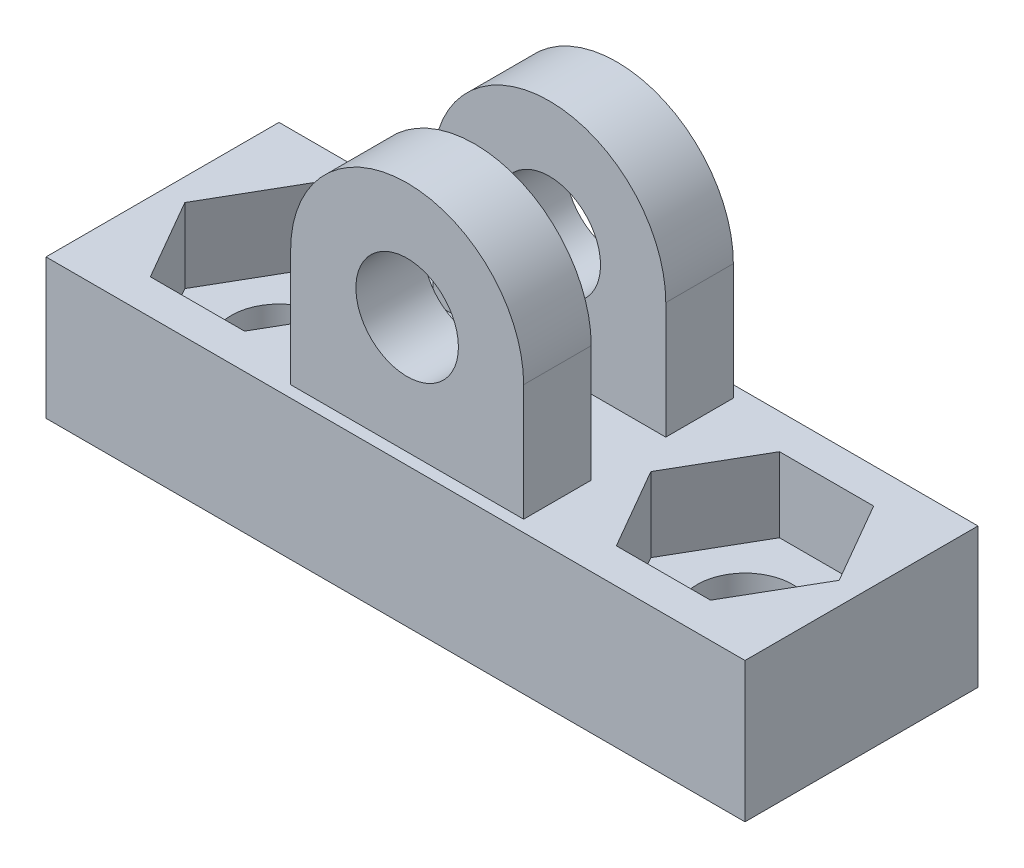
ISO-10303-21;
HEADER;
FILE_DESCRIPTION(('STEP AP214'),'2;1');
FILE_NAME('part.step','',(''),(''),'','','');
FILE_SCHEMA(('AUTOMOTIVE_DESIGN { 1 0 10303 214 1 1 1 1 }'));
ENDSEC;
DATA;
#1=APPLICATION_CONTEXT('core data for automotive mechanical design processes');
#2=APPLICATION_PROTOCOL_DEFINITION('international standard','automotive_design',2000,#1);
#3=PRODUCT_CONTEXT('',#1,'mechanical');
#4=PRODUCT('Part','Part','',(#3));
#5=PRODUCT_RELATED_PRODUCT_CATEGORY('part','',(#4));
#6=PRODUCT_DEFINITION_FORMATION('','',#4);
#7=PRODUCT_DEFINITION_CONTEXT('part definition',#1,'design');
#8=PRODUCT_DEFINITION('design','',#6,#7);
#9=PRODUCT_DEFINITION_SHAPE('','',#8);
#10=(LENGTH_UNIT() NAMED_UNIT(*) SI_UNIT(.MILLI.,.METRE.));
#11=(NAMED_UNIT(*) PLANE_ANGLE_UNIT() SI_UNIT($,.RADIAN.));
#12=(NAMED_UNIT(*) SI_UNIT($,.STERADIAN.) SOLID_ANGLE_UNIT());
#13=UNCERTAINTY_MEASURE_WITH_UNIT(LENGTH_MEASURE(1.E-05),#10,'distance_accuracy_value','');
#14=(GEOMETRIC_REPRESENTATION_CONTEXT(3) GLOBAL_UNCERTAINTY_ASSIGNED_CONTEXT((#13)) GLOBAL_UNIT_ASSIGNED_CONTEXT((#10,
#11,#12)) REPRESENTATION_CONTEXT('',''));
#15=CARTESIAN_POINT('',(0.,0.,0.));
#16=DIRECTION('',(0.,0.,1.));
#17=DIRECTION('',(1.,0.,0.));
#18=AXIS2_PLACEMENT_3D('',#15,#16,#17);
#19=CARTESIAN_POINT('',(15.,6.,4.5));
#20=DIRECTION('',(-1.,0.,0.));
#21=DIRECTION('',(0.,-1.,0.));
#22=AXIS2_PLACEMENT_3D('',#19,#20,#21);
#23=PLANE('',#22);
#24=DIRECTION('',(0.,1.,0.));
#25=VECTOR('',#24,1.);
#26=CARTESIAN_POINT('',(15.,6.,-1.6));
#27=LINE('',#26,#25);
#28=CARTESIAN_POINT('',(15.,6.,-1.6));
#29=VERTEX_POINT('',#28);
#30=CARTESIAN_POINT('',(15.,11.,-1.6));
#31=VERTEX_POINT('',#30);
#32=EDGE_CURVE('E441',#29,#31,#27,.T.);
#33=ORIENTED_EDGE('',*,*,#32,.F.);
#34=DIRECTION('',(0.,0.,-1.));
#35=VECTOR('',#34,1.);
#36=CARTESIAN_POINT('',(15.,6.,4.5));
#37=LINE('',#36,#35);
#38=CARTESIAN_POINT('',(15.,6.,-4.5));
#39=VERTEX_POINT('',#38);
#40=EDGE_CURVE('E229',#29,#39,#37,.T.);
#41=ORIENTED_EDGE('',*,*,#40,.T.);
#42=DIRECTION('',(0.,1.,0.));
#43=VECTOR('',#42,1.);
#44=CARTESIAN_POINT('',(15.,6.,-4.5));
#45=LINE('',#44,#43);
#46=CARTESIAN_POINT('',(15.,11.,-4.5));
#47=VERTEX_POINT('',#46);
#48=EDGE_CURVE('E470',#39,#47,#45,.T.);
#49=ORIENTED_EDGE('',*,*,#48,.T.);
#50=DIRECTION('',(0.,0.,-1.));
#51=VECTOR('',#50,1.);
#52=CARTESIAN_POINT('',(15.,11.,4.5));
#53=LINE('',#52,#51);
#54=EDGE_CURVE('E486',#31,#47,#53,.T.);
#55=ORIENTED_EDGE('',*,*,#54,.F.);
#56=EDGE_LOOP('',(#33,#41,#49,#55));
#57=FACE_BOUND('',#56,.T.);
#58=ADVANCED_FACE('F45',(#57),#23,.F.);
#59=CARTESIAN_POINT('',(10.,11.,4.5));
#60=DIRECTION('',(0.,0.,-1.));
#61=DIRECTION('',(-1.,0.,0.));
#62=AXIS2_PLACEMENT_3D('',#59,#60,#61);
#63=CYLINDRICAL_SURFACE('',#62,5.);
#64=CARTESIAN_POINT('',(10.,11.,-1.6));
#65=DIRECTION('',(0.,0.,1.));
#66=DIRECTION('',(1.,0.,0.));
#67=AXIS2_PLACEMENT_3D('',#64,#65,#66);
#68=CIRCLE('',#67,5.);
#69=CARTESIAN_POINT('',(5.,11.,-1.6));
#70=VERTEX_POINT('',#69);
#71=EDGE_CURVE('E438',#31,#70,#68,.T.);
#72=ORIENTED_EDGE('',*,*,#71,.F.);
#73=ORIENTED_EDGE('',*,*,#54,.T.);
#74=CARTESIAN_POINT('',(10.,11.,-4.5));
#75=DIRECTION('',(0.,0.,1.));
#76=DIRECTION('',(1.,0.,0.));
#77=AXIS2_PLACEMENT_3D('',#74,#75,#76);
#78=CIRCLE('',#77,5.);
#79=CARTESIAN_POINT('',(5.,11.,-4.5));
#80=VERTEX_POINT('',#79);
#81=EDGE_CURVE('E474',#47,#80,#78,.T.);
#82=ORIENTED_EDGE('',*,*,#81,.T.);
#83=DIRECTION('',(0.,0.,-1.));
#84=VECTOR('',#83,1.);
#85=CARTESIAN_POINT('',(5.,11.,4.5));
#86=LINE('',#85,#84);
#87=EDGE_CURVE('E482',#70,#80,#86,.T.);
#88=ORIENTED_EDGE('',*,*,#87,.F.);
#89=EDGE_LOOP('',(#72,#73,#82,#88));
#90=FACE_BOUND('',#89,.T.);
#91=ADVANCED_FACE('F502',(#90),#63,.T.);
#92=CARTESIAN_POINT('',(5.,6.,4.5));
#93=DIRECTION('',(1.,0.,0.));
#94=DIRECTION('',(0.,0.,-1.));
#95=AXIS2_PLACEMENT_3D('',#92,#93,#94);
#96=PLANE('',#95);
#97=DIRECTION('',(0.,-1.,0.));
#98=VECTOR('',#97,1.);
#99=CARTESIAN_POINT('',(5.,6.,-1.6));
#100=LINE('',#99,#98);
#101=CARTESIAN_POINT('',(5.,6.,-1.6));
#102=VERTEX_POINT('',#101);
#103=EDGE_CURVE('E435',#70,#102,#100,.T.);
#104=ORIENTED_EDGE('',*,*,#103,.F.);
#105=ORIENTED_EDGE('',*,*,#87,.T.);
#106=DIRECTION('',(0.,-1.,0.));
#107=VECTOR('',#106,1.);
#108=CARTESIAN_POINT('',(5.,6.,-4.5));
#109=LINE('',#108,#107);
#110=CARTESIAN_POINT('',(5.,6.,-4.5));
#111=VERTEX_POINT('',#110);
#112=EDGE_CURVE('E456',#80,#111,#109,.T.);
#113=ORIENTED_EDGE('',*,*,#112,.T.);
#114=DIRECTION('',(0.,0.,-1.));
#115=VECTOR('',#114,1.);
#116=CARTESIAN_POINT('',(5.,6.,4.5));
#117=LINE('',#116,#115);
#118=EDGE_CURVE('E466',#102,#111,#117,.T.);
#119=ORIENTED_EDGE('',*,*,#118,.F.);
#120=EDGE_LOOP('',(#104,#105,#113,#119));
#121=FACE_BOUND('',#120,.T.);
#122=ADVANCED_FACE('F495',(#121),#96,.F.);
#123=CARTESIAN_POINT('',(10.,11.,4.5));
#124=DIRECTION('',(0.,0.,-1.));
#125=DIRECTION('',(-1.,0.,0.));
#126=AXIS2_PLACEMENT_3D('',#123,#124,#125);
#127=CYLINDRICAL_SURFACE('',#126,2.20000000000086);
#128=CARTESIAN_POINT('',(10.,11.,-4.5));
#129=DIRECTION('',(0.,0.,1.));
#130=DIRECTION('',(1.,0.,0.));
#131=AXIS2_PLACEMENT_3D('',#128,#129,#130);
#132=CIRCLE('',#131,2.20000000000086);
#133=CARTESIAN_POINT('',(12.2000000000009,11.,-4.5));
#134=VERTEX_POINT('',#133);
#135=EDGE_CURVE('E444',#134,#134,#132,.T.);
#136=ORIENTED_EDGE('',*,*,#135,.F.);
#137=EDGE_LOOP('',(#136));
#138=FACE_BOUND('',#137,.T.);
#139=CARTESIAN_POINT('',(10.,11.,-1.6));
#140=DIRECTION('',(0.,0.,1.));
#141=DIRECTION('',(1.,0.,0.));
#142=AXIS2_PLACEMENT_3D('',#139,#140,#141);
#143=CIRCLE('',#142,2.20000000000086);
#144=CARTESIAN_POINT('',(12.2000000000009,11.,-1.6));
#145=VERTEX_POINT('',#144);
#146=EDGE_CURVE('E49',#145,#145,#143,.T.);
#147=ORIENTED_EDGE('',*,*,#146,.T.);
#148=EDGE_LOOP('',(#147));
#149=FACE_BOUND('',#148,.T.);
#150=ADVANCED_FACE('F516',(#138,#149),#127,.F.);
#151=CARTESIAN_POINT('',(0.,6.,0.));
#152=DIRECTION('',(0.,-1.,0.));
#153=DIRECTION('',(0.,0.,-1.));
#154=AXIS2_PLACEMENT_3D('',#151,#152,#153);
#155=PLANE('',#154);
#156=ORIENTED_EDGE('',*,*,#40,.F.);
#157=DIRECTION('',(1.,0.,0.));
#158=VECTOR('',#157,1.);
#159=CARTESIAN_POINT('',(20.0691974439735,6.,-1.6));
#160=LINE('',#159,#158);
#161=EDGE_CURVE('E222',#102,#29,#160,.T.);
#162=ORIENTED_EDGE('',*,*,#161,.F.);
#163=ORIENTED_EDGE('',*,*,#118,.T.);
#164=DIRECTION('',(1.,0.,0.));
#165=VECTOR('',#164,1.);
#166=CARTESIAN_POINT('',(15.,6.,-4.5));
#167=LINE('',#166,#165);
#168=EDGE_CURVE('E449',#111,#39,#167,.T.);
#169=ORIENTED_EDGE('',*,*,#168,.T.);
#170=EDGE_LOOP('',(#156,#162,#163,#169));
#171=FACE_BOUND('',#170,.T.);
#172=DIRECTION('',(-1.,0.,0.));
#173=VECTOR('',#172,1.);
#174=CARTESIAN_POINT('',(2.02072594216369,6.,-3.5));
#175=LINE('',#174,#173);
#176=CARTESIAN_POINT('',(2.02072594216369,6.,-3.5));
#177=VERTEX_POINT('',#176);
#178=CARTESIAN_POINT('',(-2.02072594216369,6.,-3.5));
#179=VERTEX_POINT('',#178);
#180=EDGE_CURVE('E354',#177,#179,#175,.T.);
#181=ORIENTED_EDGE('',*,*,#180,.F.);
#182=DIRECTION('',(-0.5,0.,-0.866025403784439));
#183=VECTOR('',#182,1.);
#184=CARTESIAN_POINT('',(4.04145188432738,6.,0.));
#185=LINE('',#184,#183);
#186=CARTESIAN_POINT('',(4.04145188432738,6.,0.));
#187=VERTEX_POINT('',#186);
#188=EDGE_CURVE('E351',#187,#177,#185,.T.);
#189=ORIENTED_EDGE('',*,*,#188,.F.);
#190=DIRECTION('',(0.5,0.,-0.866025403784439));
#191=VECTOR('',#190,1.);
#192=CARTESIAN_POINT('',(2.02072594216369,6.,3.5));
#193=LINE('',#192,#191);
#194=CARTESIAN_POINT('',(2.02072594216369,6.,3.5));
#195=VERTEX_POINT('',#194);
#196=EDGE_CURVE('E322',#195,#187,#193,.T.);
#197=ORIENTED_EDGE('',*,*,#196,.F.);
#198=DIRECTION('',(1.,0.,0.));
#199=VECTOR('',#198,1.);
#200=CARTESIAN_POINT('',(-2.02072594216369,6.,3.5));
#201=LINE('',#200,#199);
#202=CARTESIAN_POINT('',(-2.02072594216369,6.,3.5));
#203=VERTEX_POINT('',#202);
#204=EDGE_CURVE('E328',#203,#195,#201,.T.);
#205=ORIENTED_EDGE('',*,*,#204,.F.);
#206=DIRECTION('',(0.5,0.,0.866025403784439));
#207=VECTOR('',#206,1.);
#208=CARTESIAN_POINT('',(-4.04145188432738,6.,0.));
#209=LINE('',#208,#207);
#210=CARTESIAN_POINT('',(-4.04145188432738,6.,0.));
#211=VERTEX_POINT('',#210);
#212=EDGE_CURVE('E362',#211,#203,#209,.T.);
#213=ORIENTED_EDGE('',*,*,#212,.F.);
#214=DIRECTION('',(-0.5,0.,0.866025403784439));
#215=VECTOR('',#214,1.);
#216=CARTESIAN_POINT('',(-2.02072594216369,6.,-3.5));
#217=LINE('',#216,#215);
#218=EDGE_CURVE('E358',#179,#211,#217,.T.);
#219=ORIENTED_EDGE('',*,*,#218,.F.);
#220=EDGE_LOOP('',(#181,#189,#197,#205,#213,#219));
#221=FACE_BOUND('',#220,.T.);
#222=DIRECTION('',(1.,0.,0.));
#223=VECTOR('',#222,1.);
#224=CARTESIAN_POINT('',(20.0691974439735,6.,1.6));
#225=LINE('',#224,#223);
#226=CARTESIAN_POINT('',(5.,6.,1.6));
#227=VERTEX_POINT('',#226);
#228=CARTESIAN_POINT('',(15.,6.,1.6));
#229=VERTEX_POINT('',#228);
#230=EDGE_CURVE('E63',#227,#229,#225,.T.);
#231=ORIENTED_EDGE('',*,*,#230,.T.);
#232=CARTESIAN_POINT('',(15.,6.,4.5));
#233=VERTEX_POINT('',#232);
#234=EDGE_CURVE('E70',#233,#229,#37,.T.);
#235=ORIENTED_EDGE('',*,*,#234,.F.);
#236=DIRECTION('',(1.,0.,0.));
#237=VECTOR('',#236,1.);
#238=CARTESIAN_POINT('',(15.,6.,4.5));
#239=LINE('',#238,#237);
#240=CARTESIAN_POINT('',(5.,6.,4.5));
#241=VERTEX_POINT('',#240);
#242=EDGE_CURVE('E453',#241,#233,#239,.T.);
#243=ORIENTED_EDGE('',*,*,#242,.F.);
#244=EDGE_CURVE('E220',#241,#227,#117,.T.);
#245=ORIENTED_EDGE('',*,*,#244,.T.);
#246=EDGE_LOOP('',(#231,#235,#243,#245));
#247=FACE_BOUND('',#246,.T.);
#248=DIRECTION('',(0.5,0.,0.866025403784439));
#249=VECTOR('',#248,1.);
#250=CARTESIAN_POINT('',(15.9585481156726,6.,0.));
#251=LINE('',#250,#249);
#252=CARTESIAN_POINT('',(15.9585481156726,6.,0.));
#253=VERTEX_POINT('',#252);
#254=CARTESIAN_POINT('',(17.9792740578363,6.,3.5));
#255=VERTEX_POINT('',#254);
#256=EDGE_CURVE('E275',#253,#255,#251,.T.);
#257=ORIENTED_EDGE('',*,*,#256,.F.);
#258=DIRECTION('',(-0.5,0.,0.866025403784439));
#259=VECTOR('',#258,1.);
#260=CARTESIAN_POINT('',(17.9792740578363,6.,-3.5));
#261=LINE('',#260,#259);
#262=CARTESIAN_POINT('',(17.9792740578363,6.,-3.5));
#263=VERTEX_POINT('',#262);
#264=EDGE_CURVE('E272',#263,#253,#261,.T.);
#265=ORIENTED_EDGE('',*,*,#264,.F.);
#266=DIRECTION('',(-1.,0.,0.));
#267=VECTOR('',#266,1.);
#268=CARTESIAN_POINT('',(22.0207259421637,6.,-3.5));
#269=LINE('',#268,#267);
#270=CARTESIAN_POINT('',(22.0207259421637,6.,-3.5));
#271=VERTEX_POINT('',#270);
#272=EDGE_CURVE('E268',#271,#263,#269,.T.);
#273=ORIENTED_EDGE('',*,*,#272,.F.);
#274=DIRECTION('',(-0.5,0.,-0.866025403784439));
#275=VECTOR('',#274,1.);
#276=CARTESIAN_POINT('',(24.0414518843274,6.,0.));
#277=LINE('',#276,#275);
#278=CARTESIAN_POINT('',(24.0414518843274,6.,0.));
#279=VERTEX_POINT('',#278);
#280=EDGE_CURVE('E233',#279,#271,#277,.T.);
#281=ORIENTED_EDGE('',*,*,#280,.F.);
#282=DIRECTION('',(0.499999999999999,0.,-0.866025403784439));
#283=VECTOR('',#282,1.);
#284=CARTESIAN_POINT('',(22.0207259421637,6.,3.5));
#285=LINE('',#284,#283);
#286=CARTESIAN_POINT('',(22.0207259421637,6.,3.5));
#287=VERTEX_POINT('',#286);
#288=EDGE_CURVE('E228',#287,#279,#285,.T.);
#289=ORIENTED_EDGE('',*,*,#288,.F.);
#290=DIRECTION('',(1.,0.,0.));
#291=VECTOR('',#290,1.);
#292=CARTESIAN_POINT('',(17.9792740578363,6.,3.5));
#293=LINE('',#292,#291);
#294=EDGE_CURVE('E244',#255,#287,#293,.T.);
#295=ORIENTED_EDGE('',*,*,#294,.F.);
#296=EDGE_LOOP('',(#257,#265,#273,#281,#289,#295));
#297=FACE_BOUND('',#296,.T.);
#298=DIRECTION('',(1.,0.,0.));
#299=VECTOR('',#298,1.);
#300=CARTESIAN_POINT('',(-5.,6.,5.));
#301=LINE('',#300,#299);
#302=CARTESIAN_POINT('',(-5.,6.,5.));
#303=VERTEX_POINT('',#302);
#304=CARTESIAN_POINT('',(25.,6.,5.));
#305=VERTEX_POINT('',#304);
#306=EDGE_CURVE('E401',#303,#305,#301,.T.);
#307=ORIENTED_EDGE('',*,*,#306,.T.);
#308=DIRECTION('',(0.,0.,1.));
#309=VECTOR('',#308,1.);
#310=CARTESIAN_POINT('',(25.,6.,5.));
#311=LINE('',#310,#309);
#312=CARTESIAN_POINT('',(25.,6.,-5.));
#313=VERTEX_POINT('',#312);
#314=EDGE_CURVE('E318',#313,#305,#311,.T.);
#315=ORIENTED_EDGE('',*,*,#314,.F.);
#316=DIRECTION('',(-1.,0.,0.));
#317=VECTOR('',#316,1.);
#318=CARTESIAN_POINT('',(-5.,6.,-5.));
#319=LINE('',#318,#317);
#320=CARTESIAN_POINT('',(-5.,6.,-5.));
#321=VERTEX_POINT('',#320);
#322=EDGE_CURVE('E394',#313,#321,#319,.T.);
#323=ORIENTED_EDGE('',*,*,#322,.T.);
#324=DIRECTION('',(0.,0.,1.));
#325=VECTOR('',#324,1.);
#326=CARTESIAN_POINT('',(-5.,6.,5.));
#327=LINE('',#326,#325);
#328=EDGE_CURVE('E397',#321,#303,#327,.T.);
#329=ORIENTED_EDGE('',*,*,#328,.T.);
#330=EDGE_LOOP('',(#307,#315,#323,#329));
#331=FACE_BOUND('',#330,.T.);
#332=ADVANCED_FACE('F217',(#171,#221,#247,#297,#331),#155,.F.);
#333=CARTESIAN_POINT('',(20.,0.,0.));
#334=DIRECTION('',(0.,1.,0.));
#335=DIRECTION('',(0.,0.,1.));
#336=AXIS2_PLACEMENT_3D('',#333,#334,#335);
#337=CYLINDRICAL_SURFACE('',#336,2.05);
#338=CARTESIAN_POINT('',(20.,0.,0.));
#339=DIRECTION('',(0.,1.,0.));
#340=DIRECTION('',(0.,0.,1.));
#341=AXIS2_PLACEMENT_3D('',#338,#339,#340);
#342=CIRCLE('',#341,2.05);
#343=CARTESIAN_POINT('',(20.,0.,2.05));
#344=VERTEX_POINT('',#343);
#345=EDGE_CURVE('E302',#344,#344,#342,.T.);
#346=ORIENTED_EDGE('',*,*,#345,.F.);
#347=EDGE_LOOP('',(#346));
#348=FACE_BOUND('',#347,.T.);
#349=CARTESIAN_POINT('',(20.,2.8,0.));
#350=DIRECTION('',(0.,1.,0.));
#351=DIRECTION('',(0.,0.,1.));
#352=AXIS2_PLACEMENT_3D('',#349,#350,#351);
#353=CIRCLE('',#352,2.05);
#354=CARTESIAN_POINT('',(20.,2.8,2.05));
#355=VERTEX_POINT('',#354);
#356=EDGE_CURVE('E284',#355,#355,#353,.F.);
#357=ORIENTED_EDGE('',*,*,#356,.F.);
#358=EDGE_LOOP('',(#357));
#359=FACE_BOUND('',#358,.T.);
#360=ADVANCED_FACE('F561',(#348,#359),#337,.F.);
#361=CARTESIAN_POINT('',(0.,6.,0.));
#362=DIRECTION('',(0.,-1.,0.));
#363=DIRECTION('',(0.,0.,-1.));
#364=AXIS2_PLACEMENT_3D('',#361,#362,#363);
#365=CYLINDRICAL_SURFACE('',#364,2.05);
#366=CARTESIAN_POINT('',(0.,0.,0.));
#367=DIRECTION('',(0.,1.,0.));
#368=DIRECTION('',(0.,0.,1.));
#369=AXIS2_PLACEMENT_3D('',#366,#367,#368);
#370=CIRCLE('',#369,2.05);
#371=CARTESIAN_POINT('',(0.,0.,2.05));
#372=VERTEX_POINT('',#371);
#373=EDGE_CURVE('E389',#372,#372,#370,.T.);
#374=ORIENTED_EDGE('',*,*,#373,.F.);
#375=EDGE_LOOP('',(#374));
#376=FACE_BOUND('',#375,.T.);
#377=CARTESIAN_POINT('',(0.,2.8,0.));
#378=DIRECTION('',(0.,1.,0.));
#379=DIRECTION('',(0.,0.,1.));
#380=AXIS2_PLACEMENT_3D('',#377,#378,#379);
#381=CIRCLE('',#380,2.05);
#382=CARTESIAN_POINT('',(0.,2.8,2.05));
#383=VERTEX_POINT('',#382);
#384=EDGE_CURVE('E372',#383,#383,#381,.T.);
#385=ORIENTED_EDGE('',*,*,#384,.T.);
#386=EDGE_LOOP('',(#385));
#387=FACE_BOUND('',#386,.T.);
#388=ADVANCED_FACE('F758',(#376,#387),#365,.F.);
#389=CARTESIAN_POINT('',(0.,0.,0.));
#390=DIRECTION('',(0.,-1.,0.));
#391=DIRECTION('',(0.,0.,-1.));
#392=AXIS2_PLACEMENT_3D('',#389,#390,#391);
#393=PLANE('',#392);
#394=ORIENTED_EDGE('',*,*,#345,.T.);
#395=EDGE_LOOP('',(#394));
#396=FACE_BOUND('',#395,.T.);
#397=DIRECTION('',(-1.,0.,0.));
#398=VECTOR('',#397,1.);
#399=CARTESIAN_POINT('',(-5.,0.,-5.));
#400=LINE('',#399,#398);
#401=CARTESIAN_POINT('',(25.,0.,-5.));
#402=VERTEX_POINT('',#401);
#403=CARTESIAN_POINT('',(-5.,0.,-5.));
#404=VERTEX_POINT('',#403);
#405=EDGE_CURVE('E393',#402,#404,#400,.T.);
#406=ORIENTED_EDGE('',*,*,#405,.F.);
#407=DIRECTION('',(0.,0.,-1.));
#408=VECTOR('',#407,1.);
#409=CARTESIAN_POINT('',(25.,0.,5.));
#410=LINE('',#409,#408);
#411=CARTESIAN_POINT('',(25.,0.,5.));
#412=VERTEX_POINT('',#411);
#413=EDGE_CURVE('E310',#412,#402,#410,.T.);
#414=ORIENTED_EDGE('',*,*,#413,.F.);
#415=DIRECTION('',(1.,0.,0.));
#416=VECTOR('',#415,1.);
#417=CARTESIAN_POINT('',(-5.,0.,5.));
#418=LINE('',#417,#416);
#419=CARTESIAN_POINT('',(-5.,0.,5.));
#420=VERTEX_POINT('',#419);
#421=EDGE_CURVE('E398',#420,#412,#418,.T.);
#422=ORIENTED_EDGE('',*,*,#421,.F.);
#423=DIRECTION('',(0.,0.,1.));
#424=VECTOR('',#423,1.);
#425=CARTESIAN_POINT('',(-5.,0.,5.));
#426=LINE('',#425,#424);
#427=EDGE_CURVE('E406',#404,#420,#426,.T.);
#428=ORIENTED_EDGE('',*,*,#427,.F.);
#429=EDGE_LOOP('',(#406,#414,#422,#428));
#430=FACE_BOUND('',#429,.T.);
#431=ORIENTED_EDGE('',*,*,#373,.T.);
#432=EDGE_LOOP('',(#431));
#433=FACE_BOUND('',#432,.T.);
#434=ADVANCED_FACE('F765',(#396,#430,#433),#393,.T.);
#435=CARTESIAN_POINT('',(-5.,6.,-5.));
#436=DIRECTION('',(0.,0.,1.));
#437=DIRECTION('',(1.,0.,0.));
#438=AXIS2_PLACEMENT_3D('',#435,#436,#437);
#439=PLANE('',#438);
#440=ORIENTED_EDGE('',*,*,#405,.T.);
#441=DIRECTION('',(0.,-1.,0.));
#442=VECTOR('',#441,1.);
#443=CARTESIAN_POINT('',(-5.,6.,-5.));
#444=LINE('',#443,#442);
#445=EDGE_CURVE('E11',#321,#404,#444,.T.);
#446=ORIENTED_EDGE('',*,*,#445,.F.);
#447=ORIENTED_EDGE('',*,*,#322,.F.);
#448=DIRECTION('',(0.,1.,0.));
#449=VECTOR('',#448,1.);
#450=CARTESIAN_POINT('',(25.,6.,-5.));
#451=LINE('',#450,#449);
#452=EDGE_CURVE('E314',#402,#313,#451,.T.);
#453=ORIENTED_EDGE('',*,*,#452,.F.);
#454=EDGE_LOOP('',(#440,#446,#447,#453));
#455=FACE_BOUND('',#454,.T.);
#456=ADVANCED_FACE('F47',(#455),#439,.F.);
#457=CARTESIAN_POINT('',(-5.,6.,5.));
#458=DIRECTION('',(1.,0.,0.));
#459=DIRECTION('',(0.,0.,-1.));
#460=AXIS2_PLACEMENT_3D('',#457,#458,#459);
#461=PLANE('',#460);
#462=ORIENTED_EDGE('',*,*,#427,.T.);
#463=DIRECTION('',(0.,-1.,0.));
#464=VECTOR('',#463,1.);
#465=CARTESIAN_POINT('',(-5.,6.,5.));
#466=LINE('',#465,#464);
#467=EDGE_CURVE('E55',#303,#420,#466,.T.);
#468=ORIENTED_EDGE('',*,*,#467,.F.);
#469=ORIENTED_EDGE('',*,*,#328,.F.);
#470=ORIENTED_EDGE('',*,*,#445,.T.);
#471=EDGE_LOOP('',(#462,#468,#469,#470));
#472=FACE_BOUND('',#471,.T.);
#473=ADVANCED_FACE('F789',(#472),#461,.F.);
#474=CARTESIAN_POINT('',(-5.,6.,5.));
#475=DIRECTION('',(0.,0.,-1.));
#476=DIRECTION('',(-1.,0.,0.));
#477=AXIS2_PLACEMENT_3D('',#474,#475,#476);
#478=PLANE('',#477);
#479=ORIENTED_EDGE('',*,*,#421,.T.);
#480=DIRECTION('',(0.,-1.,0.));
#481=VECTOR('',#480,1.);
#482=CARTESIAN_POINT('',(25.,6.,5.));
#483=LINE('',#482,#481);
#484=EDGE_CURVE('E306',#305,#412,#483,.T.);
#485=ORIENTED_EDGE('',*,*,#484,.F.);
#486=ORIENTED_EDGE('',*,*,#306,.F.);
#487=ORIENTED_EDGE('',*,*,#467,.T.);
#488=EDGE_LOOP('',(#479,#485,#486,#487));
#489=FACE_BOUND('',#488,.T.);
#490=ADVANCED_FACE('F652',(#489),#478,.F.);
#491=CARTESIAN_POINT('',(2.02072594216369,2.8,3.5));
#492=DIRECTION('',(0.866025403784439,0.,0.5));
#493=DIRECTION('',(0.5,0.,-0.866025403784439));
#494=AXIS2_PLACEMENT_3D('',#491,#492,#493);
#495=PLANE('',#494);
#496=ORIENTED_EDGE('',*,*,#196,.T.);
#497=DIRECTION('',(0.,1.,0.));
#498=VECTOR('',#497,1.);
#499=CARTESIAN_POINT('',(4.04145188432738,2.8,0.));
#500=LINE('',#499,#498);
#501=CARTESIAN_POINT('',(4.04145188432738,2.8,0.));
#502=VERTEX_POINT('',#501);
#503=EDGE_CURVE('E348',#502,#187,#500,.T.);
#504=ORIENTED_EDGE('',*,*,#503,.F.);
#505=DIRECTION('',(0.5,0.,-0.866025403784439));
#506=VECTOR('',#505,1.);
#507=CARTESIAN_POINT('',(2.02072594216369,2.8,3.5));
#508=LINE('',#507,#506);
#509=CARTESIAN_POINT('',(2.02072594216369,2.8,3.5));
#510=VERTEX_POINT('',#509);
#511=EDGE_CURVE('E323',#510,#502,#508,.T.);
#512=ORIENTED_EDGE('',*,*,#511,.F.);
#513=DIRECTION('',(0.,1.,0.));
#514=VECTOR('',#513,1.);
#515=CARTESIAN_POINT('',(2.02072594216369,2.8,3.5));
#516=LINE('',#515,#514);
#517=EDGE_CURVE('E369',#510,#195,#516,.T.);
#518=ORIENTED_EDGE('',*,*,#517,.T.);
#519=EDGE_LOOP('',(#496,#504,#512,#518));
#520=FACE_BOUND('',#519,.T.);
#521=ADVANCED_FACE('F646',(#520),#495,.F.);
#522=CARTESIAN_POINT('',(-2.02072594216369,2.8,3.5));
#523=DIRECTION('',(0.,0.,1.));
#524=DIRECTION('',(1.,0.,0.));
#525=AXIS2_PLACEMENT_3D('',#522,#523,#524);
#526=PLANE('',#525);
#527=ORIENTED_EDGE('',*,*,#204,.T.);
#528=ORIENTED_EDGE('',*,*,#517,.F.);
#529=DIRECTION('',(1.,0.,0.));
#530=VECTOR('',#529,1.);
#531=CARTESIAN_POINT('',(-2.02072594216369,2.8,3.5));
#532=LINE('',#531,#530);
#533=CARTESIAN_POINT('',(-2.02072594216369,2.8,3.5));
#534=VERTEX_POINT('',#533);
#535=EDGE_CURVE('E344',#534,#510,#532,.T.);
#536=ORIENTED_EDGE('',*,*,#535,.F.);
#537=DIRECTION('',(0.,1.,0.));
#538=VECTOR('',#537,1.);
#539=CARTESIAN_POINT('',(-2.02072594216369,2.8,3.5));
#540=LINE('',#539,#538);
#541=EDGE_CURVE('E373',#534,#203,#540,.T.);
#542=ORIENTED_EDGE('',*,*,#541,.T.);
#543=EDGE_LOOP('',(#527,#528,#536,#542));
#544=FACE_BOUND('',#543,.T.);
#545=ADVANCED_FACE('F651',(#544),#526,.F.);
#546=CARTESIAN_POINT('',(-4.04145188432738,2.8,0.));
#547=DIRECTION('',(-0.866025403784439,0.,0.5));
#548=DIRECTION('',(0.5,0.,0.866025403784439));
#549=AXIS2_PLACEMENT_3D('',#546,#547,#548);
#550=PLANE('',#549);
#551=ORIENTED_EDGE('',*,*,#212,.T.);
#552=ORIENTED_EDGE('',*,*,#541,.F.);
#553=DIRECTION('',(0.5,0.,0.866025403784439));
#554=VECTOR('',#553,1.);
#555=CARTESIAN_POINT('',(-4.04145188432738,2.8,0.));
#556=LINE('',#555,#554);
#557=CARTESIAN_POINT('',(-4.04145188432738,2.8,0.));
#558=VERTEX_POINT('',#557);
#559=EDGE_CURVE('E340',#558,#534,#556,.T.);
#560=ORIENTED_EDGE('',*,*,#559,.F.);
#561=DIRECTION('',(0.,1.,0.));
#562=VECTOR('',#561,1.);
#563=CARTESIAN_POINT('',(-4.04145188432738,2.8,0.));
#564=LINE('',#563,#562);
#565=EDGE_CURVE('E376',#558,#211,#564,.T.);
#566=ORIENTED_EDGE('',*,*,#565,.T.);
#567=EDGE_LOOP('',(#551,#552,#560,#566));
#568=FACE_BOUND('',#567,.T.);
#569=ADVANCED_FACE('F825',(#568),#550,.F.);
#570=CARTESIAN_POINT('',(-2.02072594216369,2.8,-3.5));
#571=DIRECTION('',(-0.866025403784439,0.,-0.5));
#572=DIRECTION('',(-0.5,0.,0.866025403784439));
#573=AXIS2_PLACEMENT_3D('',#570,#571,#572);
#574=PLANE('',#573);
#575=ORIENTED_EDGE('',*,*,#218,.T.);
#576=ORIENTED_EDGE('',*,*,#565,.F.);
#577=DIRECTION('',(-0.5,0.,0.866025403784439));
#578=VECTOR('',#577,1.);
#579=CARTESIAN_POINT('',(-2.02072594216369,2.8,-3.5));
#580=LINE('',#579,#578);
#581=CARTESIAN_POINT('',(-2.02072594216369,2.8,-3.5));
#582=VERTEX_POINT('',#581);
#583=EDGE_CURVE('E336',#582,#558,#580,.T.);
#584=ORIENTED_EDGE('',*,*,#583,.F.);
#585=DIRECTION('',(0.,1.,0.));
#586=VECTOR('',#585,1.);
#587=CARTESIAN_POINT('',(-2.02072594216369,2.8,-3.5));
#588=LINE('',#587,#586);
#589=EDGE_CURVE('E379',#582,#179,#588,.T.);
#590=ORIENTED_EDGE('',*,*,#589,.T.);
#591=EDGE_LOOP('',(#575,#576,#584,#590));
#592=FACE_BOUND('',#591,.T.);
#593=ADVANCED_FACE('F814',(#592),#574,.F.);
#594=CARTESIAN_POINT('',(2.02072594216369,2.8,-3.5));
#595=DIRECTION('',(0.,0.,-1.));
#596=DIRECTION('',(-1.,0.,0.));
#597=AXIS2_PLACEMENT_3D('',#594,#595,#596);
#598=PLANE('',#597);
#599=ORIENTED_EDGE('',*,*,#180,.T.);
#600=ORIENTED_EDGE('',*,*,#589,.F.);
#601=DIRECTION('',(-1.,0.,0.));
#602=VECTOR('',#601,1.);
#603=CARTESIAN_POINT('',(2.02072594216369,2.8,-3.5));
#604=LINE('',#603,#602);
#605=CARTESIAN_POINT('',(2.02072594216369,2.8,-3.5));
#606=VERTEX_POINT('',#605);
#607=EDGE_CURVE('E332',#606,#582,#604,.T.);
#608=ORIENTED_EDGE('',*,*,#607,.F.);
#609=DIRECTION('',(0.,1.,0.));
#610=VECTOR('',#609,1.);
#611=CARTESIAN_POINT('',(2.02072594216369,2.8,-3.5));
#612=LINE('',#611,#610);
#613=EDGE_CURVE('E382',#606,#177,#612,.T.);
#614=ORIENTED_EDGE('',*,*,#613,.T.);
#615=EDGE_LOOP('',(#599,#600,#608,#614));
#616=FACE_BOUND('',#615,.T.);
#617=ADVANCED_FACE('F635',(#616),#598,.F.);
#618=CARTESIAN_POINT('',(4.04145188432738,2.8,0.));
#619=DIRECTION('',(0.866025403784439,0.,-0.5));
#620=DIRECTION('',(-0.5,0.,-0.866025403784439));
#621=AXIS2_PLACEMENT_3D('',#618,#619,#620);
#622=PLANE('',#621);
#623=ORIENTED_EDGE('',*,*,#188,.T.);
#624=ORIENTED_EDGE('',*,*,#613,.F.);
#625=DIRECTION('',(-0.5,0.,-0.866025403784439));
#626=VECTOR('',#625,1.);
#627=CARTESIAN_POINT('',(4.04145188432738,2.8,0.));
#628=LINE('',#627,#626);
#629=EDGE_CURVE('E327',#502,#606,#628,.T.);
#630=ORIENTED_EDGE('',*,*,#629,.F.);
#631=ORIENTED_EDGE('',*,*,#503,.T.);
#632=EDGE_LOOP('',(#623,#624,#630,#631));
#633=FACE_BOUND('',#632,.T.);
#634=ADVANCED_FACE('F629',(#633),#622,.F.);
#635=CARTESIAN_POINT('',(0.,2.8,0.));
#636=DIRECTION('',(0.,1.,0.));
#637=DIRECTION('',(0.,0.,1.));
#638=AXIS2_PLACEMENT_3D('',#635,#636,#637);
#639=PLANE('',#638);
#640=ORIENTED_EDGE('',*,*,#384,.F.);
#641=EDGE_LOOP('',(#640));
#642=FACE_BOUND('',#641,.T.);
#643=ORIENTED_EDGE('',*,*,#511,.T.);
#644=ORIENTED_EDGE('',*,*,#629,.T.);
#645=ORIENTED_EDGE('',*,*,#607,.T.);
#646=ORIENTED_EDGE('',*,*,#583,.T.);
#647=ORIENTED_EDGE('',*,*,#559,.T.);
#648=ORIENTED_EDGE('',*,*,#535,.T.);
#649=EDGE_LOOP('',(#643,#644,#645,#646,#647,#648));
#650=FACE_BOUND('',#649,.T.);
#651=ADVANCED_FACE('F634',(#642,#650),#639,.T.);
#652=CARTESIAN_POINT('',(25.,0.,0.));
#653=DIRECTION('',(1.,0.,0.));
#654=DIRECTION('',(0.,0.,-1.));
#655=AXIS2_PLACEMENT_3D('',#652,#653,#654);
#656=PLANE('',#655);
#657=ORIENTED_EDGE('',*,*,#484,.T.);
#658=ORIENTED_EDGE('',*,*,#413,.T.);
#659=ORIENTED_EDGE('',*,*,#452,.T.);
#660=ORIENTED_EDGE('',*,*,#314,.T.);
#661=EDGE_LOOP('',(#657,#658,#659,#660));
#662=FACE_BOUND('',#661,.T.);
#663=ADVANCED_FACE('F747',(#662),#656,.T.);
#664=CARTESIAN_POINT('',(0.,2.8,0.));
#665=DIRECTION('',(0.,1.,0.));
#666=DIRECTION('',(0.,0.,1.));
#667=AXIS2_PLACEMENT_3D('',#664,#665,#666);
#668=PLANE('',#667);
#669=DIRECTION('',(0.499999999999999,0.,-0.866025403784439));
#670=VECTOR('',#669,1.);
#671=CARTESIAN_POINT('',(22.0207259421637,2.8,3.5));
#672=LINE('',#671,#670);
#673=CARTESIAN_POINT('',(22.0207259421637,2.8,3.5));
#674=VERTEX_POINT('',#673);
#675=CARTESIAN_POINT('',(24.0414518843274,2.8,0.));
#676=VERTEX_POINT('',#675);
#677=EDGE_CURVE('E239',#674,#676,#672,.T.);
#678=ORIENTED_EDGE('',*,*,#677,.T.);
#679=DIRECTION('',(-0.5,0.,-0.866025403784439));
#680=VECTOR('',#679,1.);
#681=CARTESIAN_POINT('',(24.0414518843274,2.8,0.));
#682=LINE('',#681,#680);
#683=CARTESIAN_POINT('',(22.0207259421637,2.8,-3.5));
#684=VERTEX_POINT('',#683);
#685=EDGE_CURVE('E243',#676,#684,#682,.T.);
#686=ORIENTED_EDGE('',*,*,#685,.T.);
#687=DIRECTION('',(-1.,0.,0.));
#688=VECTOR('',#687,1.);
#689=CARTESIAN_POINT('',(22.0207259421637,2.8,-3.5));
#690=LINE('',#689,#688);
#691=CARTESIAN_POINT('',(17.9792740578363,2.8,-3.5));
#692=VERTEX_POINT('',#691);
#693=EDGE_CURVE('E248',#684,#692,#690,.T.);
#694=ORIENTED_EDGE('',*,*,#693,.T.);
#695=DIRECTION('',(-0.5,0.,0.866025403784439));
#696=VECTOR('',#695,1.);
#697=CARTESIAN_POINT('',(17.9792740578363,2.8,-3.5));
#698=LINE('',#697,#696);
#699=CARTESIAN_POINT('',(15.9585481156726,2.8,0.));
#700=VERTEX_POINT('',#699);
#701=EDGE_CURVE('E252',#692,#700,#698,.T.);
#702=ORIENTED_EDGE('',*,*,#701,.T.);
#703=DIRECTION('',(0.5,0.,0.866025403784439));
#704=VECTOR('',#703,1.);
#705=CARTESIAN_POINT('',(15.9585481156726,2.8,0.));
#706=LINE('',#705,#704);
#707=CARTESIAN_POINT('',(17.9792740578363,2.8,3.5));
#708=VERTEX_POINT('',#707);
#709=EDGE_CURVE('E256',#700,#708,#706,.T.);
#710=ORIENTED_EDGE('',*,*,#709,.T.);
#711=DIRECTION('',(1.,0.,0.));
#712=VECTOR('',#711,1.);
#713=CARTESIAN_POINT('',(17.9792740578363,2.8,3.5));
#714=LINE('',#713,#712);
#715=EDGE_CURVE('E260',#708,#674,#714,.T.);
#716=ORIENTED_EDGE('',*,*,#715,.T.);
#717=EDGE_LOOP('',(#678,#686,#694,#702,#710,#716));
#718=FACE_BOUND('',#717,.T.);
#719=ORIENTED_EDGE('',*,*,#356,.T.);
#720=EDGE_LOOP('',(#719));
#721=FACE_BOUND('',#720,.T.);
#722=ADVANCED_FACE('F736',(#718,#721),#668,.T.);
#723=CARTESIAN_POINT('',(22.0207259421637,2.8,3.5));
#724=DIRECTION('',(0.866025403784439,0.,0.499999999999999));
#725=DIRECTION('',(0.499999999999999,0.,-0.866025403784439));
#726=AXIS2_PLACEMENT_3D('',#723,#724,#725);
#727=PLANE('',#726);
#728=ORIENTED_EDGE('',*,*,#288,.T.);
#729=DIRECTION('',(0.,1.,0.));
#730=VECTOR('',#729,1.);
#731=CARTESIAN_POINT('',(24.0414518843274,2.8,0.));
#732=LINE('',#731,#730);
#733=EDGE_CURVE('E263',#676,#279,#732,.T.);
#734=ORIENTED_EDGE('',*,*,#733,.F.);
#735=ORIENTED_EDGE('',*,*,#677,.F.);
#736=DIRECTION('',(0.,1.,0.));
#737=VECTOR('',#736,1.);
#738=CARTESIAN_POINT('',(22.0207259421637,2.8,3.5));
#739=LINE('',#738,#737);
#740=EDGE_CURVE('E281',#674,#287,#739,.T.);
#741=ORIENTED_EDGE('',*,*,#740,.T.);
#742=EDGE_LOOP('',(#728,#734,#735,#741));
#743=FACE_BOUND('',#742,.T.);
#744=ADVANCED_FACE('F725',(#743),#727,.F.);
#745=CARTESIAN_POINT('',(17.9792740578363,2.8,3.5));
#746=DIRECTION('',(0.,0.,1.));
#747=DIRECTION('',(1.,0.,0.));
#748=AXIS2_PLACEMENT_3D('',#745,#746,#747);
#749=PLANE('',#748);
#750=ORIENTED_EDGE('',*,*,#294,.T.);
#751=ORIENTED_EDGE('',*,*,#740,.F.);
#752=ORIENTED_EDGE('',*,*,#715,.F.);
#753=DIRECTION('',(0.,1.,0.));
#754=VECTOR('',#753,1.);
#755=CARTESIAN_POINT('',(17.9792740578363,2.8,3.5));
#756=LINE('',#755,#754);
#757=EDGE_CURVE('E285',#708,#255,#756,.T.);
#758=ORIENTED_EDGE('',*,*,#757,.T.);
#759=EDGE_LOOP('',(#750,#751,#752,#758));
#760=FACE_BOUND('',#759,.T.);
#761=ADVANCED_FACE('F620',(#760),#749,.F.);
#762=CARTESIAN_POINT('',(15.9585481156726,2.8,0.));
#763=DIRECTION('',(-0.866025403784439,0.,0.5));
#764=DIRECTION('',(0.5,0.,0.866025403784439));
#765=AXIS2_PLACEMENT_3D('',#762,#763,#764);
#766=PLANE('',#765);
#767=ORIENTED_EDGE('',*,*,#256,.T.);
#768=ORIENTED_EDGE('',*,*,#757,.F.);
#769=ORIENTED_EDGE('',*,*,#709,.F.);
#770=DIRECTION('',(0.,1.,0.));
#771=VECTOR('',#770,1.);
#772=CARTESIAN_POINT('',(15.9585481156726,2.8,0.));
#773=LINE('',#772,#771);
#774=EDGE_CURVE('E289',#700,#253,#773,.T.);
#775=ORIENTED_EDGE('',*,*,#774,.T.);
#776=EDGE_LOOP('',(#767,#768,#769,#775));
#777=FACE_BOUND('',#776,.T.);
#778=ADVANCED_FACE('F607',(#777),#766,.F.);
#779=CARTESIAN_POINT('',(17.9792740578363,2.8,-3.5));
#780=DIRECTION('',(-0.866025403784439,0.,-0.5));
#781=DIRECTION('',(-0.5,0.,0.866025403784439));
#782=AXIS2_PLACEMENT_3D('',#779,#780,#781);
#783=PLANE('',#782);
#784=ORIENTED_EDGE('',*,*,#264,.T.);
#785=ORIENTED_EDGE('',*,*,#774,.F.);
#786=ORIENTED_EDGE('',*,*,#701,.F.);
#787=DIRECTION('',(0.,1.,0.));
#788=VECTOR('',#787,1.);
#789=CARTESIAN_POINT('',(17.9792740578363,2.8,-3.5));
#790=LINE('',#789,#788);
#791=EDGE_CURVE('E293',#692,#263,#790,.T.);
#792=ORIENTED_EDGE('',*,*,#791,.T.);
#793=EDGE_LOOP('',(#784,#785,#786,#792));
#794=FACE_BOUND('',#793,.T.);
#795=ADVANCED_FACE('F601',(#794),#783,.F.);
#796=CARTESIAN_POINT('',(22.0207259421637,2.8,-3.5));
#797=DIRECTION('',(0.,0.,-1.));
#798=DIRECTION('',(-1.,0.,0.));
#799=AXIS2_PLACEMENT_3D('',#796,#797,#798);
#800=PLANE('',#799);
#801=ORIENTED_EDGE('',*,*,#272,.T.);
#802=ORIENTED_EDGE('',*,*,#791,.F.);
#803=ORIENTED_EDGE('',*,*,#693,.F.);
#804=DIRECTION('',(0.,1.,0.));
#805=VECTOR('',#804,1.);
#806=CARTESIAN_POINT('',(22.0207259421637,2.8,-3.5));
#807=LINE('',#806,#805);
#808=EDGE_CURVE('E296',#684,#271,#807,.T.);
#809=ORIENTED_EDGE('',*,*,#808,.T.);
#810=EDGE_LOOP('',(#801,#802,#803,#809));
#811=FACE_BOUND('',#810,.T.);
#812=ADVANCED_FACE('F606',(#811),#800,.F.);
#813=CARTESIAN_POINT('',(24.0414518843274,2.8,0.));
#814=DIRECTION('',(0.866025403784439,0.,-0.5));
#815=DIRECTION('',(-0.5,0.,-0.866025403784439));
#816=AXIS2_PLACEMENT_3D('',#813,#814,#815);
#817=PLANE('',#816);
#818=ORIENTED_EDGE('',*,*,#280,.T.);
#819=ORIENTED_EDGE('',*,*,#808,.F.);
#820=ORIENTED_EDGE('',*,*,#685,.F.);
#821=ORIENTED_EDGE('',*,*,#733,.T.);
#822=EDGE_LOOP('',(#818,#819,#820,#821));
#823=FACE_BOUND('',#822,.T.);
#824=ADVANCED_FACE('F543',(#823),#817,.F.);
#825=CARTESIAN_POINT('',(10.,11.,4.5));
#826=DIRECTION('',(0.,0.,1.));
#827=DIRECTION('',(1.,0.,0.));
#828=AXIS2_PLACEMENT_3D('',#825,#826,#827);
#829=PLANE('',#828);
#830=ORIENTED_EDGE('',*,*,#242,.T.);
#831=DIRECTION('',(0.,1.,0.));
#832=VECTOR('',#831,1.);
#833=CARTESIAN_POINT('',(15.,6.,4.5));
#834=LINE('',#833,#832);
#835=CARTESIAN_POINT('',(15.,11.,4.5));
#836=VERTEX_POINT('',#835);
#837=EDGE_CURVE('E225',#233,#836,#834,.T.);
#838=ORIENTED_EDGE('',*,*,#837,.T.);
#839=CARTESIAN_POINT('',(10.,11.,4.5));
#840=DIRECTION('',(0.,0.,1.));
#841=DIRECTION('',(1.,0.,0.));
#842=AXIS2_PLACEMENT_3D('',#839,#840,#841);
#843=CIRCLE('',#842,5.);
#844=CARTESIAN_POINT('',(5.,11.,4.5));
#845=VERTEX_POINT('',#844);
#846=EDGE_CURVE('E459',#836,#845,#843,.T.);
#847=ORIENTED_EDGE('',*,*,#846,.T.);
#848=DIRECTION('',(0.,-1.,0.));
#849=VECTOR('',#848,1.);
#850=CARTESIAN_POINT('',(5.,6.,4.5));
#851=LINE('',#850,#849);
#852=EDGE_CURVE('E462',#845,#241,#851,.T.);
#853=ORIENTED_EDGE('',*,*,#852,.T.);
#854=EDGE_LOOP('',(#830,#838,#847,#853));
#855=FACE_BOUND('',#854,.T.);
#856=CARTESIAN_POINT('',(10.,11.,4.5));
#857=DIRECTION('',(0.,0.,1.));
#858=DIRECTION('',(1.,0.,0.));
#859=AXIS2_PLACEMENT_3D('',#856,#857,#858);
#860=CIRCLE('',#859,2.20000000000086);
#861=CARTESIAN_POINT('',(12.2000000000009,11.,4.5));
#862=VERTEX_POINT('',#861);
#863=EDGE_CURVE('E445',#862,#862,#860,.T.);
#864=ORIENTED_EDGE('',*,*,#863,.F.);
#865=EDGE_LOOP('',(#864));
#866=FACE_BOUND('',#865,.T.);
#867=ADVANCED_FACE('F538',(#855,#866),#829,.T.);
#868=CARTESIAN_POINT('',(10.,11.,-4.5));
#869=DIRECTION('',(0.,0.,1.));
#870=DIRECTION('',(1.,0.,0.));
#871=AXIS2_PLACEMENT_3D('',#868,#869,#870);
#872=PLANE('',#871);
#873=ORIENTED_EDGE('',*,*,#168,.F.);
#874=ORIENTED_EDGE('',*,*,#112,.F.);
#875=ORIENTED_EDGE('',*,*,#81,.F.);
#876=ORIENTED_EDGE('',*,*,#48,.F.);
#877=EDGE_LOOP('',(#873,#874,#875,#876));
#878=FACE_BOUND('',#877,.T.);
#879=ORIENTED_EDGE('',*,*,#135,.T.);
#880=EDGE_LOOP('',(#879));
#881=FACE_BOUND('',#880,.T.);
#882=ADVANCED_FACE('F506',(#878,#881),#872,.F.);
#883=ORIENTED_EDGE('',*,*,#234,.T.);
#884=DIRECTION('',(0.,1.,0.));
#885=VECTOR('',#884,1.);
#886=CARTESIAN_POINT('',(15.,6.,1.6));
#887=LINE('',#886,#885);
#888=CARTESIAN_POINT('',(15.,11.,1.6));
#889=VERTEX_POINT('',#888);
#890=EDGE_CURVE('E207',#229,#889,#887,.T.);
#891=ORIENTED_EDGE('',*,*,#890,.T.);
#892=EDGE_CURVE('E235',#836,#889,#53,.T.);
#893=ORIENTED_EDGE('',*,*,#892,.F.);
#894=ORIENTED_EDGE('',*,*,#837,.F.);
#895=EDGE_LOOP('',(#883,#891,#893,#894));
#896=FACE_BOUND('',#895,.T.);
#897=ADVANCED_FACE('F224',(#896),#23,.F.);
#898=ORIENTED_EDGE('',*,*,#892,.T.);
#899=CARTESIAN_POINT('',(10.,11.,1.6));
#900=DIRECTION('',(0.,0.,1.));
#901=DIRECTION('',(1.,0.,0.));
#902=AXIS2_PLACEMENT_3D('',#899,#900,#901);
#903=CIRCLE('',#902,5.);
#904=CARTESIAN_POINT('',(5.,11.,1.6));
#905=VERTEX_POINT('',#904);
#906=EDGE_CURVE('E210',#889,#905,#903,.T.);
#907=ORIENTED_EDGE('',*,*,#906,.T.);
#908=EDGE_CURVE('E483',#845,#905,#86,.T.);
#909=ORIENTED_EDGE('',*,*,#908,.F.);
#910=ORIENTED_EDGE('',*,*,#846,.F.);
#911=EDGE_LOOP('',(#898,#907,#909,#910));
#912=FACE_BOUND('',#911,.T.);
#913=ADVANCED_FACE('F529',(#912),#63,.T.);
#914=ORIENTED_EDGE('',*,*,#908,.T.);
#915=DIRECTION('',(0.,-1.,0.));
#916=VECTOR('',#915,1.);
#917=CARTESIAN_POINT('',(5.,6.,1.6));
#918=LINE('',#917,#916);
#919=EDGE_CURVE('E422',#905,#227,#918,.T.);
#920=ORIENTED_EDGE('',*,*,#919,.T.);
#921=ORIENTED_EDGE('',*,*,#244,.F.);
#922=ORIENTED_EDGE('',*,*,#852,.F.);
#923=EDGE_LOOP('',(#914,#920,#921,#922));
#924=FACE_BOUND('',#923,.T.);
#925=ADVANCED_FACE('F536',(#924),#96,.F.);
#926=CARTESIAN_POINT('',(10.,11.,1.6));
#927=DIRECTION('',(0.,0.,1.));
#928=DIRECTION('',(1.,0.,0.));
#929=AXIS2_PLACEMENT_3D('',#926,#927,#928);
#930=CIRCLE('',#929,2.20000000000086);
#931=CARTESIAN_POINT('',(12.2000000000009,11.,1.6));
#932=VERTEX_POINT('',#931);
#933=EDGE_CURVE('E419',#932,#932,#930,.T.);
#934=ORIENTED_EDGE('',*,*,#933,.F.);
#935=EDGE_LOOP('',(#934));
#936=FACE_BOUND('',#935,.T.);
#937=ORIENTED_EDGE('',*,*,#863,.T.);
#938=EDGE_LOOP('',(#937));
#939=FACE_BOUND('',#938,.T.);
#940=ADVANCED_FACE('F520',(#936,#939),#127,.F.);
#941=CARTESIAN_POINT('',(0.,0.,-1.6));
#942=DIRECTION('',(0.,0.,1.));
#943=DIRECTION('',(1.,0.,0.));
#944=AXIS2_PLACEMENT_3D('',#941,#942,#943);
#945=PLANE('',#944);
#946=ORIENTED_EDGE('',*,*,#146,.F.);
#947=EDGE_LOOP('',(#946));
#948=FACE_BOUND('',#947,.T.);
#949=ORIENTED_EDGE('',*,*,#32,.T.);
#950=ORIENTED_EDGE('',*,*,#71,.T.);
#951=ORIENTED_EDGE('',*,*,#103,.T.);
#952=ORIENTED_EDGE('',*,*,#161,.T.);
#953=EDGE_LOOP('',(#949,#950,#951,#952));
#954=FACE_BOUND('',#953,.T.);
#955=ADVANCED_FACE('F518',(#948,#954),#945,.T.);
#956=CARTESIAN_POINT('',(0.,0.,1.6));
#957=DIRECTION('',(0.,0.,1.));
#958=DIRECTION('',(1.,0.,0.));
#959=AXIS2_PLACEMENT_3D('',#956,#957,#958);
#960=PLANE('',#959);
#961=ORIENTED_EDGE('',*,*,#933,.T.);
#962=EDGE_LOOP('',(#961));
#963=FACE_BOUND('',#962,.T.);
#964=ORIENTED_EDGE('',*,*,#230,.F.);
#965=ORIENTED_EDGE('',*,*,#919,.F.);
#966=ORIENTED_EDGE('',*,*,#906,.F.);
#967=ORIENTED_EDGE('',*,*,#890,.F.);
#968=EDGE_LOOP('',(#964,#965,#966,#967));
#969=FACE_BOUND('',#968,.T.);
#970=ADVANCED_FACE('F208',(#963,#969),#960,.F.);
#971=CLOSED_SHELL('',(#58,#91,#122,#150,#332,#360,#388,#434,#456,#473,#490,#521,#545,#569,#593,
#617,#634,#651,#663,#722,#744,#761,#778,#795,#812,#824,#867,#882,#897,#913,#925,#940,#955,#970));
#972=MANIFOLD_SOLID_BREP('B2',#971);
#973=ADVANCED_BREP_SHAPE_REPRESENTATION('',(#18,#972),#14);
#974=SHAPE_DEFINITION_REPRESENTATION(#9,#973);
ENDSEC;
END-ISO-10303-21;
